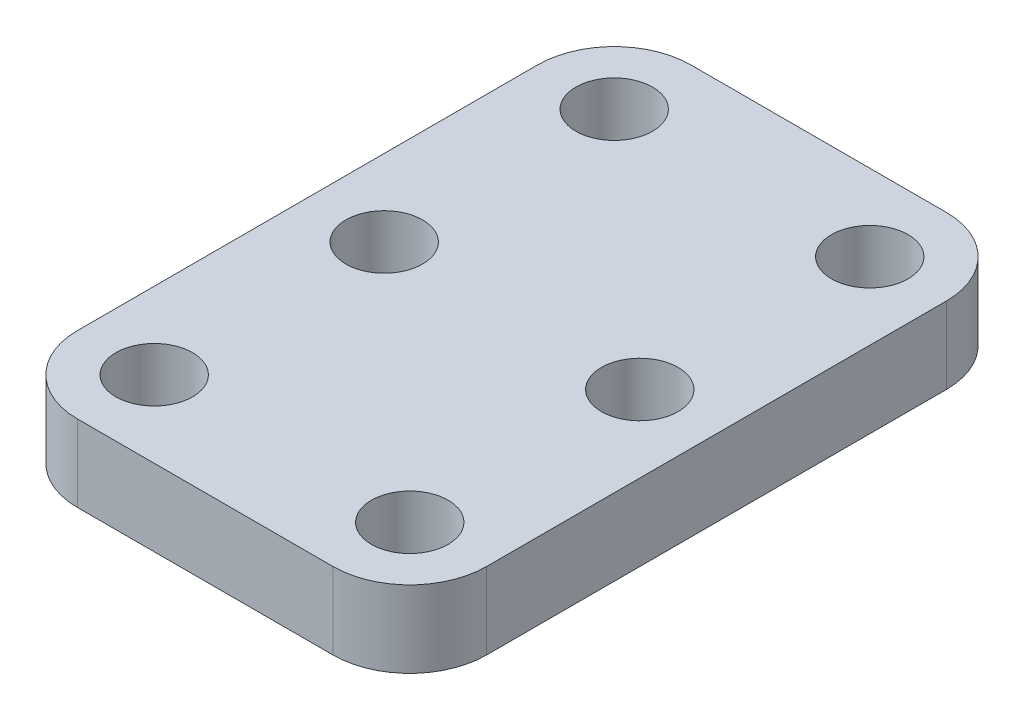
ISO-10303-21;
HEADER;
FILE_DESCRIPTION(('STEP AP214'),'2;1');
FILE_NAME('part.step','',(''),(''),'','','');
FILE_SCHEMA(('AUTOMOTIVE_DESIGN { 1 0 10303 214 1 1 1 1 }'));
ENDSEC;
DATA;
#1=APPLICATION_CONTEXT('core data for automotive mechanical design processes');
#2=APPLICATION_PROTOCOL_DEFINITION('international standard','automotive_design',2000,#1);
#3=PRODUCT_CONTEXT('',#1,'mechanical');
#4=PRODUCT('Part','Part','',(#3));
#5=PRODUCT_RELATED_PRODUCT_CATEGORY('part','',(#4));
#6=PRODUCT_DEFINITION_FORMATION('','',#4);
#7=PRODUCT_DEFINITION_CONTEXT('part definition',#1,'design');
#8=PRODUCT_DEFINITION('design','',#6,#7);
#9=PRODUCT_DEFINITION_SHAPE('','',#8);
#10=(LENGTH_UNIT() NAMED_UNIT(*) SI_UNIT(.MILLI.,.METRE.));
#11=(NAMED_UNIT(*) PLANE_ANGLE_UNIT() SI_UNIT($,.RADIAN.));
#12=(NAMED_UNIT(*) SI_UNIT($,.STERADIAN.) SOLID_ANGLE_UNIT());
#13=UNCERTAINTY_MEASURE_WITH_UNIT(LENGTH_MEASURE(1.E-05),#10,'distance_accuracy_value','');
#14=(GEOMETRIC_REPRESENTATION_CONTEXT(3) GLOBAL_UNCERTAINTY_ASSIGNED_CONTEXT((#13)) GLOBAL_UNIT_ASSIGNED_CONTEXT((#10,
#11,#12)) REPRESENTATION_CONTEXT('',''));
#15=CARTESIAN_POINT('',(0.,0.,0.));
#16=DIRECTION('',(0.,0.,1.));
#17=DIRECTION('',(1.,0.,0.));
#18=AXIS2_PLACEMENT_3D('',#15,#16,#17);
#19=CARTESIAN_POINT('',(0.,15.,0.));
#20=DIRECTION('',(1.,0.,0.));
#21=DIRECTION('',(0.,0.,-1.));
#22=AXIS2_PLACEMENT_3D('',#19,#20,#21);
#23=PLANE('',#22);
#24=DIRECTION('',(0.,0.,1.));
#25=VECTOR('',#24,1.);
#26=CARTESIAN_POINT('',(0.,15.,0.));
#27=LINE('',#26,#25);
#28=CARTESIAN_POINT('',(0.,15.,-105.));
#29=VERTEX_POINT('',#28);
#30=CARTESIAN_POINT('',(0.,15.,-15.));
#31=VERTEX_POINT('',#30);
#32=EDGE_CURVE('E130',#29,#31,#27,.T.);
#33=ORIENTED_EDGE('',*,*,#32,.F.);
#34=DIRECTION('',(0.,-1.,0.));
#35=VECTOR('',#34,1.);
#36=CARTESIAN_POINT('',(0.,15.,-105.));
#37=LINE('',#36,#35);
#38=CARTESIAN_POINT('',(0.,0.,-105.));
#39=VERTEX_POINT('',#38);
#40=EDGE_CURVE('E114',#29,#39,#37,.T.);
#41=ORIENTED_EDGE('',*,*,#40,.T.);
#42=DIRECTION('',(0.,0.,1.));
#43=VECTOR('',#42,1.);
#44=CARTESIAN_POINT('',(0.,0.,0.));
#45=LINE('',#44,#43);
#46=CARTESIAN_POINT('',(0.,0.,-15.));
#47=VERTEX_POINT('',#46);
#48=EDGE_CURVE('E127',#39,#47,#45,.T.);
#49=ORIENTED_EDGE('',*,*,#48,.T.);
#50=DIRECTION('',(0.,-1.,0.));
#51=VECTOR('',#50,1.);
#52=CARTESIAN_POINT('',(0.,15.,-15.));
#53=LINE('',#52,#51);
#54=EDGE_CURVE('E133',#47,#31,#53,.F.);
#55=ORIENTED_EDGE('',*,*,#54,.T.);
#56=EDGE_LOOP('',(#33,#41,#49,#55));
#57=FACE_BOUND('',#56,.T.);
#58=ADVANCED_FACE('F44',(#57),#23,.F.);
#59=CARTESIAN_POINT('',(0.,15.,0.));
#60=DIRECTION('',(0.,0.,-1.));
#61=DIRECTION('',(-1.,0.,0.));
#62=AXIS2_PLACEMENT_3D('',#59,#60,#61);
#63=PLANE('',#62);
#64=DIRECTION('',(1.,0.,0.));
#65=VECTOR('',#64,1.);
#66=CARTESIAN_POINT('',(0.,15.,0.));
#67=LINE('',#66,#65);
#68=CARTESIAN_POINT('',(15.,15.,0.));
#69=VERTEX_POINT('',#68);
#70=CARTESIAN_POINT('',(65.,15.,0.));
#71=VERTEX_POINT('',#70);
#72=EDGE_CURVE('E206',#69,#71,#67,.T.);
#73=ORIENTED_EDGE('',*,*,#72,.F.);
#74=DIRECTION('',(0.,-1.,0.));
#75=VECTOR('',#74,1.);
#76=CARTESIAN_POINT('',(15.,15.,0.));
#77=LINE('',#76,#75);
#78=CARTESIAN_POINT('',(15.,0.,0.));
#79=VERTEX_POINT('',#78);
#80=EDGE_CURVE('E186',#69,#79,#77,.T.);
#81=ORIENTED_EDGE('',*,*,#80,.T.);
#82=DIRECTION('',(1.,0.,0.));
#83=VECTOR('',#82,1.);
#84=CARTESIAN_POINT('',(0.,0.,0.));
#85=LINE('',#84,#83);
#86=CARTESIAN_POINT('',(65.,0.,0.));
#87=VERTEX_POINT('',#86);
#88=EDGE_CURVE('E138',#79,#87,#85,.T.);
#89=ORIENTED_EDGE('',*,*,#88,.T.);
#90=DIRECTION('',(0.,-1.,0.));
#91=VECTOR('',#90,1.);
#92=CARTESIAN_POINT('',(65.,15.,0.));
#93=LINE('',#92,#91);
#94=EDGE_CURVE('E183',#87,#71,#93,.F.);
#95=ORIENTED_EDGE('',*,*,#94,.T.);
#96=EDGE_LOOP('',(#73,#81,#89,#95));
#97=FACE_BOUND('',#96,.T.);
#98=ADVANCED_FACE('F280',(#97),#63,.F.);
#99=CARTESIAN_POINT('',(80.,15.,0.));
#100=DIRECTION('',(-1.,0.,0.));
#101=DIRECTION('',(0.,0.,1.));
#102=AXIS2_PLACEMENT_3D('',#99,#100,#101);
#103=PLANE('',#102);
#104=DIRECTION('',(0.,0.,-1.));
#105=VECTOR('',#104,1.);
#106=CARTESIAN_POINT('',(80.,0.,0.));
#107=LINE('',#106,#105);
#108=CARTESIAN_POINT('',(80.,0.,-15.));
#109=VERTEX_POINT('',#108);
#110=CARTESIAN_POINT('',(80.,0.,-105.));
#111=VERTEX_POINT('',#110);
#112=EDGE_CURVE('E144',#109,#111,#107,.T.);
#113=ORIENTED_EDGE('',*,*,#112,.T.);
#114=DIRECTION('',(0.,-1.,0.));
#115=VECTOR('',#114,1.);
#116=CARTESIAN_POINT('',(80.,15.,-105.));
#117=LINE('',#116,#115);
#118=CARTESIAN_POINT('',(80.,15.,-105.));
#119=VERTEX_POINT('',#118);
#120=EDGE_CURVE('E11',#111,#119,#117,.F.);
#121=ORIENTED_EDGE('',*,*,#120,.T.);
#122=DIRECTION('',(0.,0.,-1.));
#123=VECTOR('',#122,1.);
#124=CARTESIAN_POINT('',(80.,15.,0.));
#125=LINE('',#124,#123);
#126=CARTESIAN_POINT('',(80.,15.,-15.));
#127=VERTEX_POINT('',#126);
#128=EDGE_CURVE('E194',#127,#119,#125,.T.);
#129=ORIENTED_EDGE('',*,*,#128,.F.);
#130=DIRECTION('',(0.,-1.,0.));
#131=VECTOR('',#130,1.);
#132=CARTESIAN_POINT('',(80.,15.,-15.));
#133=LINE('',#132,#131);
#134=EDGE_CURVE('E53',#127,#109,#133,.T.);
#135=ORIENTED_EDGE('',*,*,#134,.T.);
#136=EDGE_LOOP('',(#113,#121,#129,#135));
#137=FACE_BOUND('',#136,.T.);
#138=ADVANCED_FACE('F193',(#137),#103,.F.);
#139=CARTESIAN_POINT('',(0.,15.,-120.));
#140=DIRECTION('',(0.,0.,1.));
#141=DIRECTION('',(1.,0.,0.));
#142=AXIS2_PLACEMENT_3D('',#139,#140,#141);
#143=PLANE('',#142);
#144=DIRECTION('',(-1.,0.,0.));
#145=VECTOR('',#144,1.);
#146=CARTESIAN_POINT('',(0.,0.,-120.));
#147=LINE('',#146,#145);
#148=CARTESIAN_POINT('',(65.,0.,-120.));
#149=VERTEX_POINT('',#148);
#150=CARTESIAN_POINT('',(15.,0.,-120.));
#151=VERTEX_POINT('',#150);
#152=EDGE_CURVE('E155',#149,#151,#147,.T.);
#153=ORIENTED_EDGE('',*,*,#152,.T.);
#154=DIRECTION('',(0.,-1.,0.));
#155=VECTOR('',#154,1.);
#156=CARTESIAN_POINT('',(15.,15.,-120.));
#157=LINE('',#156,#155);
#158=CARTESIAN_POINT('',(15.,15.,-120.));
#159=VERTEX_POINT('',#158);
#160=EDGE_CURVE('E115',#151,#159,#157,.F.);
#161=ORIENTED_EDGE('',*,*,#160,.T.);
#162=DIRECTION('',(-1.,0.,0.));
#163=VECTOR('',#162,1.);
#164=CARTESIAN_POINT('',(0.,15.,-120.));
#165=LINE('',#164,#163);
#166=CARTESIAN_POINT('',(65.,15.,-120.));
#167=VERTEX_POINT('',#166);
#168=EDGE_CURVE('E150',#167,#159,#165,.T.);
#169=ORIENTED_EDGE('',*,*,#168,.F.);
#170=DIRECTION('',(0.,-1.,0.));
#171=VECTOR('',#170,1.);
#172=CARTESIAN_POINT('',(65.,15.,-120.));
#173=LINE('',#172,#171);
#174=EDGE_CURVE('E121',#167,#149,#173,.T.);
#175=ORIENTED_EDGE('',*,*,#174,.T.);
#176=EDGE_LOOP('',(#153,#161,#169,#175));
#177=FACE_BOUND('',#176,.T.);
#178=ADVANCED_FACE('F202',(#177),#143,.F.);
#179=CARTESIAN_POINT('',(0.,15.,0.));
#180=DIRECTION('',(0.,-1.,0.));
#181=DIRECTION('',(0.,0.,-1.));
#182=AXIS2_PLACEMENT_3D('',#179,#180,#181);
#183=PLANE('',#182);
#184=CARTESIAN_POINT('',(15.,15.,-60.));
#185=DIRECTION('',(0.,1.,0.));
#186=DIRECTION('',(0.,0.,1.));
#187=AXIS2_PLACEMENT_3D('',#184,#185,#186);
#188=CIRCLE('',#187,7.5);
#189=CARTESIAN_POINT('',(15.,15.,-52.5));
#190=VERTEX_POINT('',#189);
#191=EDGE_CURVE('E236',#190,#190,#188,.T.);
#192=ORIENTED_EDGE('',*,*,#191,.F.);
#193=EDGE_LOOP('',(#192));
#194=FACE_BOUND('',#193,.T.);
#195=CARTESIAN_POINT('',(65.,15.,-15.));
#196=DIRECTION('',(0.,1.,0.));
#197=DIRECTION('',(0.,0.,1.));
#198=AXIS2_PLACEMENT_3D('',#195,#196,#197);
#199=CIRCLE('',#198,7.5);
#200=CARTESIAN_POINT('',(65.,15.,-7.50000000000001));
#201=VERTEX_POINT('',#200);
#202=EDGE_CURVE('E221',#201,#201,#199,.T.);
#203=ORIENTED_EDGE('',*,*,#202,.F.);
#204=EDGE_LOOP('',(#203));
#205=FACE_BOUND('',#204,.T.);
#206=CARTESIAN_POINT('',(65.,15.,-60.));
#207=DIRECTION('',(0.,1.,0.));
#208=DIRECTION('',(0.,0.,1.));
#209=AXIS2_PLACEMENT_3D('',#206,#207,#208);
#210=CIRCLE('',#209,7.5);
#211=CARTESIAN_POINT('',(65.,15.,-52.5));
#212=VERTEX_POINT('',#211);
#213=EDGE_CURVE('E220',#212,#212,#210,.T.);
#214=ORIENTED_EDGE('',*,*,#213,.F.);
#215=EDGE_LOOP('',(#214));
#216=FACE_BOUND('',#215,.T.);
#217=CARTESIAN_POINT('',(65.,15.,-105.));
#218=DIRECTION('',(0.,1.,0.));
#219=DIRECTION('',(0.,0.,1.));
#220=AXIS2_PLACEMENT_3D('',#217,#218,#219);
#221=CIRCLE('',#220,7.5);
#222=CARTESIAN_POINT('',(65.,15.,-97.5));
#223=VERTEX_POINT('',#222);
#224=EDGE_CURVE('E214',#223,#223,#221,.T.);
#225=ORIENTED_EDGE('',*,*,#224,.F.);
#226=EDGE_LOOP('',(#225));
#227=FACE_BOUND('',#226,.T.);
#228=CARTESIAN_POINT('',(15.,15.,-15.));
#229=DIRECTION('',(0.,1.,0.));
#230=DIRECTION('',(0.,0.,1.));
#231=AXIS2_PLACEMENT_3D('',#228,#229,#230);
#232=CIRCLE('',#231,7.5);
#233=CARTESIAN_POINT('',(15.,15.,-7.50000000000001));
#234=VERTEX_POINT('',#233);
#235=EDGE_CURVE('E237',#234,#234,#232,.T.);
#236=ORIENTED_EDGE('',*,*,#235,.F.);
#237=EDGE_LOOP('',(#236));
#238=FACE_BOUND('',#237,.T.);
#239=CARTESIAN_POINT('',(15.,15.,-105.));
#240=DIRECTION('',(0.,1.,0.));
#241=DIRECTION('',(0.,0.,1.));
#242=AXIS2_PLACEMENT_3D('',#239,#240,#241);
#243=CIRCLE('',#242,7.5);
#244=CARTESIAN_POINT('',(15.,15.,-97.5));
#245=VERTEX_POINT('',#244);
#246=EDGE_CURVE('E147',#245,#245,#243,.T.);
#247=ORIENTED_EDGE('',*,*,#246,.F.);
#248=EDGE_LOOP('',(#247));
#249=FACE_BOUND('',#248,.T.);
#250=ORIENTED_EDGE('',*,*,#168,.T.);
#251=CARTESIAN_POINT('',(15.,15.,-105.));
#252=DIRECTION('',(0.,-1.,0.));
#253=DIRECTION('',(0.,0.,-1.));
#254=AXIS2_PLACEMENT_3D('',#251,#252,#253);
#255=CIRCLE('',#254,15.);
#256=EDGE_CURVE('E180',#159,#29,#255,.F.);
#257=ORIENTED_EDGE('',*,*,#256,.T.);
#258=ORIENTED_EDGE('',*,*,#32,.T.);
#259=CARTESIAN_POINT('',(15.,15.,-15.));
#260=DIRECTION('',(0.,-1.,0.));
#261=DIRECTION('',(0.,0.,-1.));
#262=AXIS2_PLACEMENT_3D('',#259,#260,#261);
#263=CIRCLE('',#262,15.);
#264=EDGE_CURVE('E177',#31,#69,#263,.F.);
#265=ORIENTED_EDGE('',*,*,#264,.T.);
#266=ORIENTED_EDGE('',*,*,#72,.T.);
#267=CARTESIAN_POINT('',(65.,15.,-15.));
#268=DIRECTION('',(0.,-1.,0.));
#269=DIRECTION('',(0.,0.,-1.));
#270=AXIS2_PLACEMENT_3D('',#267,#268,#269);
#271=CIRCLE('',#270,15.);
#272=EDGE_CURVE('E65',#71,#127,#271,.F.);
#273=ORIENTED_EDGE('',*,*,#272,.T.);
#274=ORIENTED_EDGE('',*,*,#128,.T.);
#275=CARTESIAN_POINT('',(65.,15.,-105.));
#276=DIRECTION('',(0.,-1.,0.));
#277=DIRECTION('',(0.,0.,-1.));
#278=AXIS2_PLACEMENT_3D('',#275,#276,#277);
#279=CIRCLE('',#278,15.);
#280=EDGE_CURVE('E174',#119,#167,#279,.F.);
#281=ORIENTED_EDGE('',*,*,#280,.T.);
#282=EDGE_LOOP('',(#250,#257,#258,#265,#266,#273,#274,#281));
#283=FACE_BOUND('',#282,.T.);
#284=ADVANCED_FACE('F258',(#194,#205,#216,#227,#238,#249,#283),#183,.F.);
#285=CARTESIAN_POINT('',(0.,0.,0.));
#286=DIRECTION('',(0.,-1.,0.));
#287=DIRECTION('',(0.,0.,-1.));
#288=AXIS2_PLACEMENT_3D('',#285,#286,#287);
#289=PLANE('',#288);
#290=CARTESIAN_POINT('',(15.,0.,-60.));
#291=DIRECTION('',(0.,1.,0.));
#292=DIRECTION('',(0.,0.,1.));
#293=AXIS2_PLACEMENT_3D('',#290,#291,#292);
#294=CIRCLE('',#293,7.5);
#295=CARTESIAN_POINT('',(15.,0.,-52.5));
#296=VERTEX_POINT('',#295);
#297=EDGE_CURVE('E232',#296,#296,#294,.T.);
#298=ORIENTED_EDGE('',*,*,#297,.T.);
#299=EDGE_LOOP('',(#298));
#300=FACE_BOUND('',#299,.T.);
#301=CARTESIAN_POINT('',(65.,0.,-15.));
#302=DIRECTION('',(0.,1.,0.));
#303=DIRECTION('',(0.,0.,1.));
#304=AXIS2_PLACEMENT_3D('',#301,#302,#303);
#305=CIRCLE('',#304,7.5);
#306=CARTESIAN_POINT('',(65.,0.,-7.50000000000001));
#307=VERTEX_POINT('',#306);
#308=EDGE_CURVE('E241',#307,#307,#305,.T.);
#309=ORIENTED_EDGE('',*,*,#308,.T.);
#310=EDGE_LOOP('',(#309));
#311=FACE_BOUND('',#310,.T.);
#312=CARTESIAN_POINT('',(65.,0.,-60.));
#313=DIRECTION('',(0.,1.,0.));
#314=DIRECTION('',(0.,0.,1.));
#315=AXIS2_PLACEMENT_3D('',#312,#313,#314);
#316=CIRCLE('',#315,7.5);
#317=CARTESIAN_POINT('',(65.,0.,-52.5));
#318=VERTEX_POINT('',#317);
#319=EDGE_CURVE('E216',#318,#318,#316,.T.);
#320=ORIENTED_EDGE('',*,*,#319,.T.);
#321=EDGE_LOOP('',(#320));
#322=FACE_BOUND('',#321,.T.);
#323=CARTESIAN_POINT('',(65.,0.,-105.));
#324=DIRECTION('',(0.,1.,0.));
#325=DIRECTION('',(0.,0.,1.));
#326=AXIS2_PLACEMENT_3D('',#323,#324,#325);
#327=CIRCLE('',#326,7.5);
#328=CARTESIAN_POINT('',(65.,0.,-97.5));
#329=VERTEX_POINT('',#328);
#330=EDGE_CURVE('E225',#329,#329,#327,.T.);
#331=ORIENTED_EDGE('',*,*,#330,.T.);
#332=EDGE_LOOP('',(#331));
#333=FACE_BOUND('',#332,.T.);
#334=CARTESIAN_POINT('',(15.,0.,-15.));
#335=DIRECTION('',(0.,1.,0.));
#336=DIRECTION('',(0.,0.,1.));
#337=AXIS2_PLACEMENT_3D('',#334,#335,#336);
#338=CIRCLE('',#337,7.5);
#339=CARTESIAN_POINT('',(15.,0.,-7.50000000000001));
#340=VERTEX_POINT('',#339);
#341=EDGE_CURVE('E248',#340,#340,#338,.T.);
#342=ORIENTED_EDGE('',*,*,#341,.T.);
#343=EDGE_LOOP('',(#342));
#344=FACE_BOUND('',#343,.T.);
#345=CARTESIAN_POINT('',(15.,0.,-105.));
#346=DIRECTION('',(0.,1.,0.));
#347=DIRECTION('',(0.,0.,1.));
#348=AXIS2_PLACEMENT_3D('',#345,#346,#347);
#349=CIRCLE('',#348,7.5);
#350=CARTESIAN_POINT('',(15.,0.,-97.5));
#351=VERTEX_POINT('',#350);
#352=EDGE_CURVE('E139',#351,#351,#349,.T.);
#353=ORIENTED_EDGE('',*,*,#352,.T.);
#354=EDGE_LOOP('',(#353));
#355=FACE_BOUND('',#354,.T.);
#356=ORIENTED_EDGE('',*,*,#48,.F.);
#357=CARTESIAN_POINT('',(15.,0.,-105.));
#358=DIRECTION('',(0.,-1.,0.));
#359=DIRECTION('',(0.,0.,-1.));
#360=AXIS2_PLACEMENT_3D('',#357,#358,#359);
#361=CIRCLE('',#360,15.);
#362=EDGE_CURVE('E110',#39,#151,#361,.T.);
#363=ORIENTED_EDGE('',*,*,#362,.T.);
#364=ORIENTED_EDGE('',*,*,#152,.F.);
#365=CARTESIAN_POINT('',(65.,0.,-105.));
#366=DIRECTION('',(0.,-1.,0.));
#367=DIRECTION('',(0.,0.,-1.));
#368=AXIS2_PLACEMENT_3D('',#365,#366,#367);
#369=CIRCLE('',#368,15.);
#370=EDGE_CURVE('E162',#149,#111,#369,.T.);
#371=ORIENTED_EDGE('',*,*,#370,.T.);
#372=ORIENTED_EDGE('',*,*,#112,.F.);
#373=CARTESIAN_POINT('',(65.,0.,-15.));
#374=DIRECTION('',(0.,-1.,0.));
#375=DIRECTION('',(0.,0.,-1.));
#376=AXIS2_PLACEMENT_3D('',#373,#374,#375);
#377=CIRCLE('',#376,15.);
#378=EDGE_CURVE('E132',#109,#87,#377,.T.);
#379=ORIENTED_EDGE('',*,*,#378,.T.);
#380=ORIENTED_EDGE('',*,*,#88,.F.);
#381=CARTESIAN_POINT('',(15.,0.,-15.));
#382=DIRECTION('',(0.,-1.,0.));
#383=DIRECTION('',(0.,0.,-1.));
#384=AXIS2_PLACEMENT_3D('',#381,#382,#383);
#385=CIRCLE('',#384,15.);
#386=EDGE_CURVE('E122',#79,#47,#385,.T.);
#387=ORIENTED_EDGE('',*,*,#386,.T.);
#388=EDGE_LOOP('',(#356,#363,#364,#371,#372,#379,#380,#387));
#389=FACE_BOUND('',#388,.T.);
#390=ADVANCED_FACE('F135',(#300,#311,#322,#333,#344,#355,#389),#289,.T.);
#391=CARTESIAN_POINT('',(15.,15.,-105.));
#392=DIRECTION('',(0.,-1.,0.));
#393=DIRECTION('',(0.,0.,-1.));
#394=AXIS2_PLACEMENT_3D('',#391,#392,#393);
#395=CYLINDRICAL_SURFACE('',#394,15.);
#396=ORIENTED_EDGE('',*,*,#256,.F.);
#397=ORIENTED_EDGE('',*,*,#160,.F.);
#398=ORIENTED_EDGE('',*,*,#362,.F.);
#399=ORIENTED_EDGE('',*,*,#40,.F.);
#400=EDGE_LOOP('',(#396,#397,#398,#399));
#401=FACE_BOUND('',#400,.T.);
#402=ADVANCED_FACE('F113',(#401),#395,.T.);
#403=CARTESIAN_POINT('',(15.,15.,-15.));
#404=DIRECTION('',(0.,-1.,0.));
#405=DIRECTION('',(0.,0.,-1.));
#406=AXIS2_PLACEMENT_3D('',#403,#404,#405);
#407=CYLINDRICAL_SURFACE('',#406,15.);
#408=ORIENTED_EDGE('',*,*,#264,.F.);
#409=ORIENTED_EDGE('',*,*,#54,.F.);
#410=ORIENTED_EDGE('',*,*,#386,.F.);
#411=ORIENTED_EDGE('',*,*,#80,.F.);
#412=EDGE_LOOP('',(#408,#409,#410,#411));
#413=FACE_BOUND('',#412,.T.);
#414=ADVANCED_FACE('F291',(#413),#407,.T.);
#415=CARTESIAN_POINT('',(65.,15.,-105.));
#416=DIRECTION('',(0.,-1.,0.));
#417=DIRECTION('',(0.,0.,-1.));
#418=AXIS2_PLACEMENT_3D('',#415,#416,#417);
#419=CYLINDRICAL_SURFACE('',#418,15.);
#420=ORIENTED_EDGE('',*,*,#280,.F.);
#421=ORIENTED_EDGE('',*,*,#120,.F.);
#422=ORIENTED_EDGE('',*,*,#370,.F.);
#423=ORIENTED_EDGE('',*,*,#174,.F.);
#424=EDGE_LOOP('',(#420,#421,#422,#423));
#425=FACE_BOUND('',#424,.T.);
#426=ADVANCED_FACE('F199',(#425),#419,.T.);
#427=CARTESIAN_POINT('',(65.,15.,-15.));
#428=DIRECTION('',(0.,-1.,0.));
#429=DIRECTION('',(0.,0.,-1.));
#430=AXIS2_PLACEMENT_3D('',#427,#428,#429);
#431=CYLINDRICAL_SURFACE('',#430,15.);
#432=ORIENTED_EDGE('',*,*,#272,.F.);
#433=ORIENTED_EDGE('',*,*,#94,.F.);
#434=ORIENTED_EDGE('',*,*,#378,.F.);
#435=ORIENTED_EDGE('',*,*,#134,.F.);
#436=EDGE_LOOP('',(#432,#433,#434,#435));
#437=FACE_BOUND('',#436,.T.);
#438=ADVANCED_FACE('F46',(#437),#431,.T.);
#439=CARTESIAN_POINT('',(15.,0.,-105.));
#440=DIRECTION('',(0.,1.,0.));
#441=DIRECTION('',(0.,0.,1.));
#442=AXIS2_PLACEMENT_3D('',#439,#440,#441);
#443=CYLINDRICAL_SURFACE('',#442,7.5);
#444=ORIENTED_EDGE('',*,*,#352,.F.);
#445=EDGE_LOOP('',(#444));
#446=FACE_BOUND('',#445,.T.);
#447=ORIENTED_EDGE('',*,*,#246,.T.);
#448=EDGE_LOOP('',(#447));
#449=FACE_BOUND('',#448,.T.);
#450=ADVANCED_FACE('F265',(#446,#449),#443,.F.);
#451=CARTESIAN_POINT('',(15.,0.,-15.));
#452=DIRECTION('',(0.,1.,0.));
#453=DIRECTION('',(0.,0.,1.));
#454=AXIS2_PLACEMENT_3D('',#451,#452,#453);
#455=CYLINDRICAL_SURFACE('',#454,7.5);
#456=ORIENTED_EDGE('',*,*,#341,.F.);
#457=EDGE_LOOP('',(#456));
#458=FACE_BOUND('',#457,.T.);
#459=ORIENTED_EDGE('',*,*,#235,.T.);
#460=EDGE_LOOP('',(#459));
#461=FACE_BOUND('',#460,.T.);
#462=ADVANCED_FACE('F256',(#458,#461),#455,.F.);
#463=CARTESIAN_POINT('',(65.,0.,-105.));
#464=DIRECTION('',(0.,1.,0.));
#465=DIRECTION('',(0.,0.,1.));
#466=AXIS2_PLACEMENT_3D('',#463,#464,#465);
#467=CYLINDRICAL_SURFACE('',#466,7.5);
#468=ORIENTED_EDGE('',*,*,#330,.F.);
#469=EDGE_LOOP('',(#468));
#470=FACE_BOUND('',#469,.T.);
#471=ORIENTED_EDGE('',*,*,#224,.T.);
#472=EDGE_LOOP('',(#471));
#473=FACE_BOUND('',#472,.T.);
#474=ADVANCED_FACE('F273',(#470,#473),#467,.F.);
#475=CARTESIAN_POINT('',(65.,0.,-60.));
#476=DIRECTION('',(0.,1.,0.));
#477=DIRECTION('',(0.,0.,1.));
#478=AXIS2_PLACEMENT_3D('',#475,#476,#477);
#479=CYLINDRICAL_SURFACE('',#478,7.5);
#480=ORIENTED_EDGE('',*,*,#319,.F.);
#481=EDGE_LOOP('',(#480));
#482=FACE_BOUND('',#481,.T.);
#483=ORIENTED_EDGE('',*,*,#213,.T.);
#484=EDGE_LOOP('',(#483));
#485=FACE_BOUND('',#484,.T.);
#486=ADVANCED_FACE('F348',(#482,#485),#479,.F.);
#487=CARTESIAN_POINT('',(65.,0.,-15.));
#488=DIRECTION('',(0.,1.,0.));
#489=DIRECTION('',(0.,0.,1.));
#490=AXIS2_PLACEMENT_3D('',#487,#488,#489);
#491=CYLINDRICAL_SURFACE('',#490,7.5);
#492=ORIENTED_EDGE('',*,*,#308,.F.);
#493=EDGE_LOOP('',(#492));
#494=FACE_BOUND('',#493,.T.);
#495=ORIENTED_EDGE('',*,*,#202,.T.);
#496=EDGE_LOOP('',(#495));
#497=FACE_BOUND('',#496,.T.);
#498=ADVANCED_FACE('F357',(#494,#497),#491,.F.);
#499=CARTESIAN_POINT('',(15.,0.,-60.));
#500=DIRECTION('',(0.,1.,0.));
#501=DIRECTION('',(0.,0.,1.));
#502=AXIS2_PLACEMENT_3D('',#499,#500,#501);
#503=CYLINDRICAL_SURFACE('',#502,7.5);
#504=ORIENTED_EDGE('',*,*,#297,.F.);
#505=EDGE_LOOP('',(#504));
#506=FACE_BOUND('',#505,.T.);
#507=ORIENTED_EDGE('',*,*,#191,.T.);
#508=EDGE_LOOP('',(#507));
#509=FACE_BOUND('',#508,.T.);
#510=ADVANCED_FACE('F365',(#506,#509),#503,.F.);
#511=CLOSED_SHELL('',(#58,#98,#138,#178,#284,#390,#402,#414,#426,#438,#450,#462,#474,#486,#498,#510));
#512=MANIFOLD_SOLID_BREP('B2',#511);
#513=ADVANCED_BREP_SHAPE_REPRESENTATION('',(#18,#512),#14);
#514=SHAPE_DEFINITION_REPRESENTATION(#9,#513);
ENDSEC;
END-ISO-10303-21;
